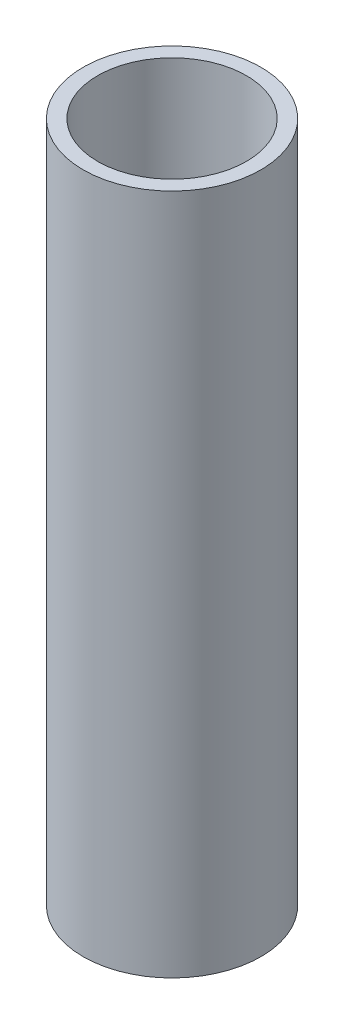
ISO-10303-21;
HEADER;
FILE_DESCRIPTION(('STEP AP214'),'2;1');
FILE_NAME('part.step','',(''),(''),'','','');
FILE_SCHEMA(('AUTOMOTIVE_DESIGN { 1 0 10303 214 1 1 1 1 }'));
ENDSEC;
DATA;
#1=APPLICATION_CONTEXT('core data for automotive mechanical design processes');
#2=APPLICATION_PROTOCOL_DEFINITION('international standard','automotive_design',2000,#1);
#3=PRODUCT_CONTEXT('',#1,'mechanical');
#4=PRODUCT('Part','Part','',(#3));
#5=PRODUCT_RELATED_PRODUCT_CATEGORY('part','',(#4));
#6=PRODUCT_DEFINITION_FORMATION('','',#4);
#7=PRODUCT_DEFINITION_CONTEXT('part definition',#1,'design');
#8=PRODUCT_DEFINITION('design','',#6,#7);
#9=PRODUCT_DEFINITION_SHAPE('','',#8);
#10=(LENGTH_UNIT() NAMED_UNIT(*) SI_UNIT(.MILLI.,.METRE.));
#11=(NAMED_UNIT(*) PLANE_ANGLE_UNIT() SI_UNIT($,.RADIAN.));
#12=(NAMED_UNIT(*) SI_UNIT($,.STERADIAN.) SOLID_ANGLE_UNIT());
#13=UNCERTAINTY_MEASURE_WITH_UNIT(LENGTH_MEASURE(1.E-05),#10,'distance_accuracy_value','');
#14=(GEOMETRIC_REPRESENTATION_CONTEXT(3) GLOBAL_UNCERTAINTY_ASSIGNED_CONTEXT((#13)) GLOBAL_UNIT_ASSIGNED_CONTEXT((#10,
#11,#12)) REPRESENTATION_CONTEXT('',''));
#15=CARTESIAN_POINT('',(0.,0.,0.));
#16=DIRECTION('',(0.,0.,1.));
#17=DIRECTION('',(1.,0.,0.));
#18=AXIS2_PLACEMENT_3D('',#15,#16,#17);
#19=CARTESIAN_POINT('',(0.,185.,0.));
#20=DIRECTION('',(0.,1.,0.));
#21=DIRECTION('',(0.,0.,1.));
#22=AXIS2_PLACEMENT_3D('',#19,#20,#21);
#23=PLANE('',#22);
#24=CARTESIAN_POINT('',(0.,185.,0.));
#25=DIRECTION('',(0.,1.,0.));
#26=DIRECTION('',(0.,0.,1.));
#27=AXIS2_PLACEMENT_3D('',#24,#25,#26);
#28=CIRCLE('',#27,24.13);
#29=CARTESIAN_POINT('',(0.,185.,24.13));
#30=VERTEX_POINT('',#29);
#31=EDGE_CURVE('E10',#30,#30,#28,.T.);
#32=ORIENTED_EDGE('',*,*,#31,.T.);
#33=EDGE_LOOP('',(#32));
#34=FACE_BOUND('',#33,.T.);
#35=CARTESIAN_POINT('',(0.,185.,0.));
#36=DIRECTION('',(0.,1.,0.));
#37=DIRECTION('',(0.,0.,1.));
#38=AXIS2_PLACEMENT_3D('',#35,#36,#37);
#39=CIRCLE('',#38,20.193);
#40=CARTESIAN_POINT('',(0.,185.,20.193));
#41=VERTEX_POINT('',#40);
#42=EDGE_CURVE('E56',#41,#41,#39,.T.);
#43=ORIENTED_EDGE('',*,*,#42,.F.);
#44=EDGE_LOOP('',(#43));
#45=FACE_BOUND('',#44,.T.);
#46=ADVANCED_FACE('F43',(#34,#45),#23,.T.);
#47=CARTESIAN_POINT('',(0.,0.,0.));
#48=DIRECTION('',(0.,1.,0.));
#49=DIRECTION('',(0.,0.,1.));
#50=AXIS2_PLACEMENT_3D('',#47,#48,#49);
#51=PLANE('',#50);
#52=CARTESIAN_POINT('',(0.,0.,0.));
#53=DIRECTION('',(0.,1.,0.));
#54=DIRECTION('',(0.,0.,1.));
#55=AXIS2_PLACEMENT_3D('',#52,#53,#54);
#56=CIRCLE('',#55,24.13);
#57=CARTESIAN_POINT('',(0.,0.,24.13));
#58=VERTEX_POINT('',#57);
#59=EDGE_CURVE('E47',#58,#58,#56,.T.);
#60=ORIENTED_EDGE('',*,*,#59,.F.);
#61=EDGE_LOOP('',(#60));
#62=FACE_BOUND('',#61,.T.);
#63=CARTESIAN_POINT('',(0.,0.,0.));
#64=DIRECTION('',(0.,1.,0.));
#65=DIRECTION('',(0.,0.,1.));
#66=AXIS2_PLACEMENT_3D('',#63,#64,#65);
#67=CIRCLE('',#66,20.193);
#68=CARTESIAN_POINT('',(0.,0.,20.193));
#69=VERTEX_POINT('',#68);
#70=EDGE_CURVE('E58',#69,#69,#67,.T.);
#71=ORIENTED_EDGE('',*,*,#70,.T.);
#72=EDGE_LOOP('',(#71));
#73=FACE_BOUND('',#72,.T.);
#74=ADVANCED_FACE('F70',(#62,#73),#51,.F.);
#75=CARTESIAN_POINT('',(0.,185.,0.));
#76=DIRECTION('',(0.,-1.,0.));
#77=DIRECTION('',(0.,0.,-1.));
#78=AXIS2_PLACEMENT_3D('',#75,#76,#77);
#79=CYLINDRICAL_SURFACE('',#78,24.13);
#80=ORIENTED_EDGE('',*,*,#31,.F.);
#81=EDGE_LOOP('',(#80));
#82=FACE_BOUND('',#81,.T.);
#83=ORIENTED_EDGE('',*,*,#59,.T.);
#84=EDGE_LOOP('',(#83));
#85=FACE_BOUND('',#84,.T.);
#86=ADVANCED_FACE('F45',(#82,#85),#79,.T.);
#87=CARTESIAN_POINT('',(0.,185.,0.));
#88=DIRECTION('',(0.,-1.,0.));
#89=DIRECTION('',(0.,0.,-1.));
#90=AXIS2_PLACEMENT_3D('',#87,#88,#89);
#91=CYLINDRICAL_SURFACE('',#90,20.193);
#92=ORIENTED_EDGE('',*,*,#42,.T.);
#93=EDGE_LOOP('',(#92));
#94=FACE_BOUND('',#93,.T.);
#95=ORIENTED_EDGE('',*,*,#70,.F.);
#96=EDGE_LOOP('',(#95));
#97=FACE_BOUND('',#96,.T.);
#98=ADVANCED_FACE('F66',(#94,#97),#91,.F.);
#99=CLOSED_SHELL('',(#46,#74,#86,#98));
#100=MANIFOLD_SOLID_BREP('B2',#99);
#101=ADVANCED_BREP_SHAPE_REPRESENTATION('',(#18,#100),#14);
#102=SHAPE_DEFINITION_REPRESENTATION(#9,#101);
ENDSEC;
END-ISO-10303-21;
